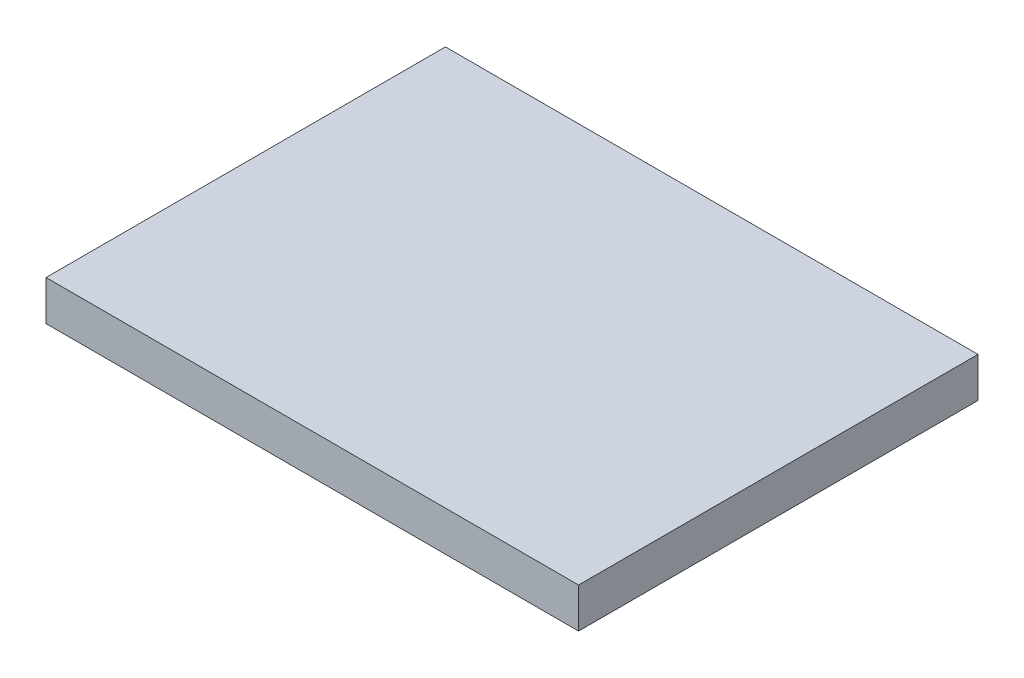
ISO-10303-21;
HEADER;
FILE_DESCRIPTION(('STEP AP214'),'2;1');
FILE_NAME('part.step','',(''),(''),'','','');
FILE_SCHEMA(('AUTOMOTIVE_DESIGN { 1 0 10303 214 1 1 1 1 }'));
ENDSEC;
DATA;
#1=APPLICATION_CONTEXT('core data for automotive mechanical design processes');
#2=APPLICATION_PROTOCOL_DEFINITION('international standard','automotive_design',2000,#1);
#3=PRODUCT_CONTEXT('',#1,'mechanical');
#4=PRODUCT('Part','Part','',(#3));
#5=PRODUCT_RELATED_PRODUCT_CATEGORY('part','',(#4));
#6=PRODUCT_DEFINITION_FORMATION('','',#4);
#7=PRODUCT_DEFINITION_CONTEXT('part definition',#1,'design');
#8=PRODUCT_DEFINITION('design','',#6,#7);
#9=PRODUCT_DEFINITION_SHAPE('','',#8);
#10=(LENGTH_UNIT() NAMED_UNIT(*) SI_UNIT(.MILLI.,.METRE.));
#11=(NAMED_UNIT(*) PLANE_ANGLE_UNIT() SI_UNIT($,.RADIAN.));
#12=(NAMED_UNIT(*) SI_UNIT($,.STERADIAN.) SOLID_ANGLE_UNIT());
#13=UNCERTAINTY_MEASURE_WITH_UNIT(LENGTH_MEASURE(1.E-05),#10,'distance_accuracy_value','');
#14=(GEOMETRIC_REPRESENTATION_CONTEXT(3) GLOBAL_UNCERTAINTY_ASSIGNED_CONTEXT((#13)) GLOBAL_UNIT_ASSIGNED_CONTEXT((#10,
#11,#12)) REPRESENTATION_CONTEXT('',''));
#15=CARTESIAN_POINT('',(0.,0.,0.));
#16=DIRECTION('',(0.,0.,1.));
#17=DIRECTION('',(1.,0.,0.));
#18=AXIS2_PLACEMENT_3D('',#15,#16,#17);
#19=CARTESIAN_POINT('',(0.,300.,0.));
#20=DIRECTION('',(-1.,0.,0.));
#21=DIRECTION('',(0.,0.,1.));
#22=AXIS2_PLACEMENT_3D('',#19,#20,#21);
#23=PLANE('',#22);
#24=DIRECTION('',(0.,0.,-1.));
#25=VECTOR('',#24,1.);
#26=CARTESIAN_POINT('',(0.,0.,0.));
#27=LINE('',#26,#25);
#28=CARTESIAN_POINT('',(0.,0.,0.));
#29=VERTEX_POINT('',#28);
#30=CARTESIAN_POINT('',(0.,0.,-3000.));
#31=VERTEX_POINT('',#30);
#32=EDGE_CURVE('E110',#29,#31,#27,.T.);
#33=ORIENTED_EDGE('',*,*,#32,.F.);
#34=DIRECTION('',(0.,-1.,0.));
#35=VECTOR('',#34,1.);
#36=CARTESIAN_POINT('',(0.,300.,0.));
#37=LINE('',#36,#35);
#38=CARTESIAN_POINT('',(0.,300.,0.));
#39=VERTEX_POINT('',#38);
#40=EDGE_CURVE('E11',#39,#29,#37,.T.);
#41=ORIENTED_EDGE('',*,*,#40,.F.);
#42=DIRECTION('',(0.,0.,-1.));
#43=VECTOR('',#42,1.);
#44=CARTESIAN_POINT('',(0.,300.,0.));
#45=LINE('',#44,#43);
#46=CARTESIAN_POINT('',(0.,300.,-3000.));
#47=VERTEX_POINT('',#46);
#48=EDGE_CURVE('E103',#39,#47,#45,.T.);
#49=ORIENTED_EDGE('',*,*,#48,.T.);
#50=DIRECTION('',(0.,-1.,0.));
#51=VECTOR('',#50,1.);
#52=CARTESIAN_POINT('',(0.,300.,-3000.));
#53=LINE('',#52,#51);
#54=EDGE_CURVE('E42',#47,#31,#53,.T.);
#55=ORIENTED_EDGE('',*,*,#54,.T.);
#56=EDGE_LOOP('',(#33,#41,#49,#55));
#57=FACE_BOUND('',#56,.T.);
#58=ADVANCED_FACE('F39',(#57),#23,.T.);
#59=CARTESIAN_POINT('',(0.,300.,0.));
#60=DIRECTION('',(0.,0.,-1.));
#61=DIRECTION('',(-1.,0.,0.));
#62=AXIS2_PLACEMENT_3D('',#59,#60,#61);
#63=PLANE('',#62);
#64=DIRECTION('',(1.,0.,0.));
#65=VECTOR('',#64,1.);
#66=CARTESIAN_POINT('',(0.,0.,0.));
#67=LINE('',#66,#65);
#68=CARTESIAN_POINT('',(4000.,0.,0.));
#69=VERTEX_POINT('',#68);
#70=EDGE_CURVE('E73',#29,#69,#67,.T.);
#71=ORIENTED_EDGE('',*,*,#70,.T.);
#72=DIRECTION('',(0.,-1.,0.));
#73=VECTOR('',#72,1.);
#74=CARTESIAN_POINT('',(4000.,300.,0.));
#75=LINE('',#74,#73);
#76=CARTESIAN_POINT('',(4000.,300.,0.));
#77=VERTEX_POINT('',#76);
#78=EDGE_CURVE('E49',#77,#69,#75,.T.);
#79=ORIENTED_EDGE('',*,*,#78,.F.);
#80=DIRECTION('',(1.,0.,0.));
#81=VECTOR('',#80,1.);
#82=CARTESIAN_POINT('',(0.,300.,0.));
#83=LINE('',#82,#81);
#84=EDGE_CURVE('E90',#39,#77,#83,.T.);
#85=ORIENTED_EDGE('',*,*,#84,.F.);
#86=ORIENTED_EDGE('',*,*,#40,.T.);
#87=EDGE_LOOP('',(#71,#79,#85,#86));
#88=FACE_BOUND('',#87,.T.);
#89=ADVANCED_FACE('F126',(#88),#63,.F.);
#90=CARTESIAN_POINT('',(4000.,300.,0.));
#91=DIRECTION('',(-1.,0.,0.));
#92=DIRECTION('',(0.,0.,1.));
#93=AXIS2_PLACEMENT_3D('',#90,#91,#92);
#94=PLANE('',#93);
#95=DIRECTION('',(0.,0.,-1.));
#96=VECTOR('',#95,1.);
#97=CARTESIAN_POINT('',(4000.,0.,0.));
#98=LINE('',#97,#96);
#99=CARTESIAN_POINT('',(4000.,0.,-3000.));
#100=VERTEX_POINT('',#99);
#101=EDGE_CURVE('E98',#69,#100,#98,.T.);
#102=ORIENTED_EDGE('',*,*,#101,.T.);
#103=DIRECTION('',(0.,-1.,0.));
#104=VECTOR('',#103,1.);
#105=CARTESIAN_POINT('',(4000.,300.,-3000.));
#106=LINE('',#105,#104);
#107=CARTESIAN_POINT('',(4000.,300.,-3000.));
#108=VERTEX_POINT('',#107);
#109=EDGE_CURVE('E95',#108,#100,#106,.T.);
#110=ORIENTED_EDGE('',*,*,#109,.F.);
#111=DIRECTION('',(0.,0.,-1.));
#112=VECTOR('',#111,1.);
#113=CARTESIAN_POINT('',(4000.,300.,0.));
#114=LINE('',#113,#112);
#115=EDGE_CURVE('E85',#77,#108,#114,.T.);
#116=ORIENTED_EDGE('',*,*,#115,.F.);
#117=ORIENTED_EDGE('',*,*,#78,.T.);
#118=EDGE_LOOP('',(#102,#110,#116,#117));
#119=FACE_BOUND('',#118,.T.);
#120=ADVANCED_FACE('F96',(#119),#94,.F.);
#121=CARTESIAN_POINT('',(0.,300.,-3000.));
#122=DIRECTION('',(0.,0.,-1.));
#123=DIRECTION('',(-1.,0.,0.));
#124=AXIS2_PLACEMENT_3D('',#121,#122,#123);
#125=PLANE('',#124);
#126=DIRECTION('',(1.,0.,0.));
#127=VECTOR('',#126,1.);
#128=CARTESIAN_POINT('',(0.,0.,-3000.));
#129=LINE('',#128,#127);
#130=EDGE_CURVE('E114',#31,#100,#129,.T.);
#131=ORIENTED_EDGE('',*,*,#130,.F.);
#132=ORIENTED_EDGE('',*,*,#54,.F.);
#133=DIRECTION('',(1.,0.,0.));
#134=VECTOR('',#133,1.);
#135=CARTESIAN_POINT('',(0.,300.,-3000.));
#136=LINE('',#135,#134);
#137=EDGE_CURVE('E89',#47,#108,#136,.T.);
#138=ORIENTED_EDGE('',*,*,#137,.T.);
#139=ORIENTED_EDGE('',*,*,#109,.T.);
#140=EDGE_LOOP('',(#131,#132,#138,#139));
#141=FACE_BOUND('',#140,.T.);
#142=ADVANCED_FACE('F101',(#141),#125,.T.);
#143=CARTESIAN_POINT('',(0.,300.,0.));
#144=DIRECTION('',(0.,-1.,0.));
#145=DIRECTION('',(0.,0.,-1.));
#146=AXIS2_PLACEMENT_3D('',#143,#144,#145);
#147=PLANE('',#146);
#148=ORIENTED_EDGE('',*,*,#48,.F.);
#149=ORIENTED_EDGE('',*,*,#84,.T.);
#150=ORIENTED_EDGE('',*,*,#115,.T.);
#151=ORIENTED_EDGE('',*,*,#137,.F.);
#152=EDGE_LOOP('',(#148,#149,#150,#151));
#153=FACE_BOUND('',#152,.T.);
#154=ADVANCED_FACE('F88',(#153),#147,.F.);
#155=CARTESIAN_POINT('',(0.,0.,0.));
#156=DIRECTION('',(0.,-1.,0.));
#157=DIRECTION('',(0.,0.,-1.));
#158=AXIS2_PLACEMENT_3D('',#155,#156,#157);
#159=PLANE('',#158);
#160=ORIENTED_EDGE('',*,*,#32,.T.);
#161=ORIENTED_EDGE('',*,*,#130,.T.);
#162=ORIENTED_EDGE('',*,*,#101,.F.);
#163=ORIENTED_EDGE('',*,*,#70,.F.);
#164=EDGE_LOOP('',(#160,#161,#162,#163));
#165=FACE_BOUND('',#164,.T.);
#166=ADVANCED_FACE('F123',(#165),#159,.T.);
#167=CLOSED_SHELL('',(#58,#89,#120,#142,#154,#166));
#168=MANIFOLD_SOLID_BREP('B2',#167);
#169=ADVANCED_BREP_SHAPE_REPRESENTATION('',(#18,#168),#14);
#170=SHAPE_DEFINITION_REPRESENTATION(#9,#169);
ENDSEC;
END-ISO-10303-21;
